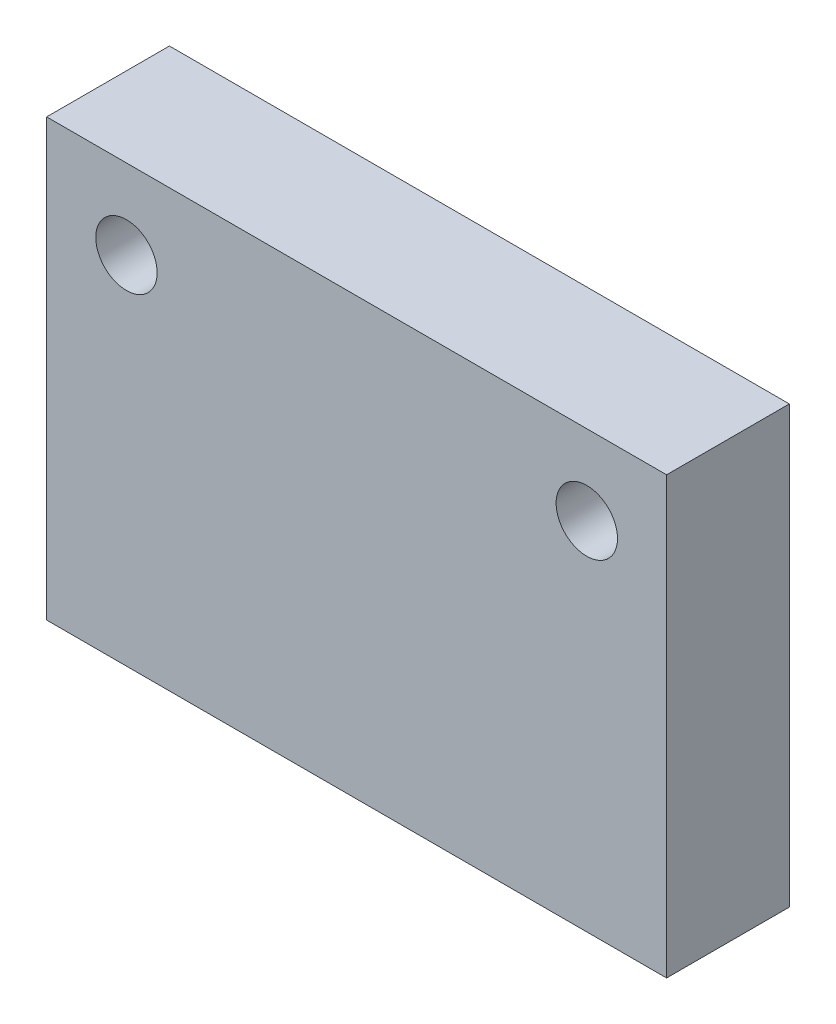
ISO-10303-21;
HEADER;
FILE_DESCRIPTION(('STEP AP214'),'2;1');
FILE_NAME('part.step','',(''),(''),'','','');
FILE_SCHEMA(('AUTOMOTIVE_DESIGN { 1 0 10303 214 1 1 1 1 }'));
ENDSEC;
DATA;
#1=APPLICATION_CONTEXT('core data for automotive mechanical design processes');
#2=APPLICATION_PROTOCOL_DEFINITION('international standard','automotive_design',2000,#1);
#3=PRODUCT_CONTEXT('',#1,'mechanical');
#4=PRODUCT('Part','Part','',(#3));
#5=PRODUCT_RELATED_PRODUCT_CATEGORY('part','',(#4));
#6=PRODUCT_DEFINITION_FORMATION('','',#4);
#7=PRODUCT_DEFINITION_CONTEXT('part definition',#1,'design');
#8=PRODUCT_DEFINITION('design','',#6,#7);
#9=PRODUCT_DEFINITION_SHAPE('','',#8);
#10=(LENGTH_UNIT() NAMED_UNIT(*) SI_UNIT(.MILLI.,.METRE.));
#11=(NAMED_UNIT(*) PLANE_ANGLE_UNIT() SI_UNIT($,.RADIAN.));
#12=(NAMED_UNIT(*) SI_UNIT($,.STERADIAN.) SOLID_ANGLE_UNIT());
#13=UNCERTAINTY_MEASURE_WITH_UNIT(LENGTH_MEASURE(1.E-05),#10,'distance_accuracy_value','');
#14=(GEOMETRIC_REPRESENTATION_CONTEXT(3) GLOBAL_UNCERTAINTY_ASSIGNED_CONTEXT((#13)) GLOBAL_UNIT_ASSIGNED_CONTEXT((#10,
#11,#12)) REPRESENTATION_CONTEXT('',''));
#15=CARTESIAN_POINT('',(0.,0.,0.));
#16=DIRECTION('',(0.,0.,1.));
#17=DIRECTION('',(1.,0.,0.));
#18=AXIS2_PLACEMENT_3D('',#15,#16,#17);
#19=CARTESIAN_POINT('',(0.,0.,4.));
#20=DIRECTION('',(0.,0.,1.));
#21=DIRECTION('',(1.,0.,0.));
#22=AXIS2_PLACEMENT_3D('',#19,#20,#21);
#23=PLANE('',#22);
#24=DIRECTION('',(-1.,0.,0.));
#25=VECTOR('',#24,1.);
#26=CARTESIAN_POINT('',(-10.1,-4.05,4.));
#27=LINE('',#26,#25);
#28=CARTESIAN_POINT('',(10.1,-4.05,4.));
#29=VERTEX_POINT('',#28);
#30=CARTESIAN_POINT('',(-10.1,-4.05,4.));
#31=VERTEX_POINT('',#30);
#32=EDGE_CURVE('E47',#29,#31,#27,.T.);
#33=ORIENTED_EDGE('',*,*,#32,.F.);
#34=DIRECTION('',(0.,1.,0.));
#35=VECTOR('',#34,1.);
#36=CARTESIAN_POINT('',(10.1,10.15,4.));
#37=LINE('',#36,#35);
#38=CARTESIAN_POINT('',(10.1,10.15,4.));
#39=VERTEX_POINT('',#38);
#40=EDGE_CURVE('E90',#29,#39,#37,.T.);
#41=ORIENTED_EDGE('',*,*,#40,.T.);
#42=DIRECTION('',(-1.,0.,0.));
#43=VECTOR('',#42,1.);
#44=CARTESIAN_POINT('',(-10.1,10.15,4.));
#45=LINE('',#44,#43);
#46=CARTESIAN_POINT('',(-10.1,10.15,4.));
#47=VERTEX_POINT('',#46);
#48=EDGE_CURVE('E55',#39,#47,#45,.T.);
#49=ORIENTED_EDGE('',*,*,#48,.T.);
#50=DIRECTION('',(0.,-1.,0.));
#51=VECTOR('',#50,1.);
#52=CARTESIAN_POINT('',(-10.1,10.15,4.));
#53=LINE('',#52,#51);
#54=EDGE_CURVE('E83',#47,#31,#53,.T.);
#55=ORIENTED_EDGE('',*,*,#54,.T.);
#56=EDGE_LOOP('',(#33,#41,#49,#55));
#57=FACE_BOUND('',#56,.T.);
#58=CARTESIAN_POINT('',(7.5,7.55,4.));
#59=DIRECTION('',(0.,0.,1.));
#60=DIRECTION('',(1.,0.,0.));
#61=AXIS2_PLACEMENT_3D('',#58,#59,#60);
#62=CIRCLE('',#61,0.999999999999999);
#63=CARTESIAN_POINT('',(8.5,7.55,4.));
#64=VERTEX_POINT('',#63);
#65=EDGE_CURVE('E95',#64,#64,#62,.T.);
#66=ORIENTED_EDGE('',*,*,#65,.F.);
#67=EDGE_LOOP('',(#66));
#68=FACE_BOUND('',#67,.T.);
#69=CARTESIAN_POINT('',(-7.5,7.55,4.));
#70=DIRECTION('',(0.,0.,1.));
#71=DIRECTION('',(-1.,0.,0.));
#72=AXIS2_PLACEMENT_3D('',#69,#70,#71);
#73=CIRCLE('',#72,1.);
#74=CARTESIAN_POINT('',(-8.5,7.55,4.));
#75=VERTEX_POINT('',#74);
#76=EDGE_CURVE('E101',#75,#75,#73,.T.);
#77=ORIENTED_EDGE('',*,*,#76,.F.);
#78=EDGE_LOOP('',(#77));
#79=FACE_BOUND('',#78,.T.);
#80=ADVANCED_FACE('F32',(#57,#68,#79),#23,.T.);
#81=CARTESIAN_POINT('',(0.,0.,0.));
#82=DIRECTION('',(0.,0.,1.));
#83=DIRECTION('',(1.,0.,0.));
#84=AXIS2_PLACEMENT_3D('',#81,#82,#83);
#85=PLANE('',#84);
#86=DIRECTION('',(0.,1.,0.));
#87=VECTOR('',#86,1.);
#88=CARTESIAN_POINT('',(10.1,10.15,0.));
#89=LINE('',#88,#87);
#90=CARTESIAN_POINT('',(10.1,-4.05,0.));
#91=VERTEX_POINT('',#90);
#92=CARTESIAN_POINT('',(10.1,10.15,0.));
#93=VERTEX_POINT('',#92);
#94=EDGE_CURVE('E78',#91,#93,#89,.T.);
#95=ORIENTED_EDGE('',*,*,#94,.F.);
#96=DIRECTION('',(-1.,0.,0.));
#97=VECTOR('',#96,1.);
#98=CARTESIAN_POINT('',(0.,-4.05,0.));
#99=LINE('',#98,#97);
#100=CARTESIAN_POINT('',(-10.1,-4.05,0.));
#101=VERTEX_POINT('',#100);
#102=EDGE_CURVE('E89',#91,#101,#99,.T.);
#103=ORIENTED_EDGE('',*,*,#102,.T.);
#104=DIRECTION('',(0.,-1.,0.));
#105=VECTOR('',#104,1.);
#106=CARTESIAN_POINT('',(-10.1,10.15,0.));
#107=LINE('',#106,#105);
#108=CARTESIAN_POINT('',(-10.1,10.15,0.));
#109=VERTEX_POINT('',#108);
#110=EDGE_CURVE('E77',#109,#101,#107,.T.);
#111=ORIENTED_EDGE('',*,*,#110,.F.);
#112=DIRECTION('',(-1.,0.,0.));
#113=VECTOR('',#112,1.);
#114=CARTESIAN_POINT('',(-10.1,10.15,0.));
#115=LINE('',#114,#113);
#116=EDGE_CURVE('E68',#93,#109,#115,.T.);
#117=ORIENTED_EDGE('',*,*,#116,.F.);
#118=EDGE_LOOP('',(#95,#103,#111,#117));
#119=FACE_BOUND('',#118,.T.);
#120=CARTESIAN_POINT('',(7.5,7.55,0.));
#121=DIRECTION('',(0.,0.,1.));
#122=DIRECTION('',(1.,0.,0.));
#123=AXIS2_PLACEMENT_3D('',#120,#121,#122);
#124=CIRCLE('',#123,0.999999999999999);
#125=CARTESIAN_POINT('',(8.5,7.55,0.));
#126=VERTEX_POINT('',#125);
#127=EDGE_CURVE('E98',#126,#126,#124,.T.);
#128=ORIENTED_EDGE('',*,*,#127,.T.);
#129=EDGE_LOOP('',(#128));
#130=FACE_BOUND('',#129,.T.);
#131=CARTESIAN_POINT('',(-7.5,7.55,0.));
#132=DIRECTION('',(0.,0.,1.));
#133=DIRECTION('',(-1.,0.,0.));
#134=AXIS2_PLACEMENT_3D('',#131,#132,#133);
#135=CIRCLE('',#134,1.);
#136=CARTESIAN_POINT('',(-8.5,7.55,0.));
#137=VERTEX_POINT('',#136);
#138=EDGE_CURVE('E104',#137,#137,#135,.T.);
#139=ORIENTED_EDGE('',*,*,#138,.T.);
#140=EDGE_LOOP('',(#139));
#141=FACE_BOUND('',#140,.T.);
#142=ADVANCED_FACE('F86',(#119,#130,#141),#85,.F.);
#143=CARTESIAN_POINT('',(10.1,10.15,4.));
#144=DIRECTION('',(-1.,0.,0.));
#145=DIRECTION('',(0.,0.,1.));
#146=AXIS2_PLACEMENT_3D('',#143,#144,#145);
#147=PLANE('',#146);
#148=ORIENTED_EDGE('',*,*,#40,.F.);
#149=DIRECTION('',(0.,0.,1.));
#150=VECTOR('',#149,1.);
#151=CARTESIAN_POINT('',(10.1,-4.05,-6.));
#152=LINE('',#151,#150);
#153=EDGE_CURVE('E110',#91,#29,#152,.T.);
#154=ORIENTED_EDGE('',*,*,#153,.F.);
#155=ORIENTED_EDGE('',*,*,#94,.T.);
#156=DIRECTION('',(0.,0.,-1.));
#157=VECTOR('',#156,1.);
#158=CARTESIAN_POINT('',(10.1,10.15,4.));
#159=LINE('',#158,#157);
#160=EDGE_CURVE('E40',#39,#93,#159,.T.);
#161=ORIENTED_EDGE('',*,*,#160,.F.);
#162=EDGE_LOOP('',(#148,#154,#155,#161));
#163=FACE_BOUND('',#162,.T.);
#164=ADVANCED_FACE('F34',(#163),#147,.F.);
#165=CARTESIAN_POINT('',(-10.1,10.15,4.));
#166=DIRECTION('',(0.,-1.,0.));
#167=DIRECTION('',(0.,0.,-1.));
#168=AXIS2_PLACEMENT_3D('',#165,#166,#167);
#169=PLANE('',#168);
#170=ORIENTED_EDGE('',*,*,#116,.T.);
#171=DIRECTION('',(0.,0.,-1.));
#172=VECTOR('',#171,1.);
#173=CARTESIAN_POINT('',(-10.1,10.15,4.));
#174=LINE('',#173,#172);
#175=EDGE_CURVE('E71',#47,#109,#174,.T.);
#176=ORIENTED_EDGE('',*,*,#175,.F.);
#177=ORIENTED_EDGE('',*,*,#48,.F.);
#178=ORIENTED_EDGE('',*,*,#160,.T.);
#179=EDGE_LOOP('',(#170,#176,#177,#178));
#180=FACE_BOUND('',#179,.T.);
#181=ADVANCED_FACE('F70',(#180),#169,.F.);
#182=CARTESIAN_POINT('',(-10.1,10.15,4.));
#183=DIRECTION('',(1.,0.,0.));
#184=DIRECTION('',(0.,0.,-1.));
#185=AXIS2_PLACEMENT_3D('',#182,#183,#184);
#186=PLANE('',#185);
#187=ORIENTED_EDGE('',*,*,#110,.T.);
#188=DIRECTION('',(0.,0.,1.));
#189=VECTOR('',#188,1.);
#190=CARTESIAN_POINT('',(-10.1,-4.05,4.));
#191=LINE('',#190,#189);
#192=EDGE_CURVE('E11',#101,#31,#191,.T.);
#193=ORIENTED_EDGE('',*,*,#192,.T.);
#194=ORIENTED_EDGE('',*,*,#54,.F.);
#195=ORIENTED_EDGE('',*,*,#175,.T.);
#196=EDGE_LOOP('',(#187,#193,#194,#195));
#197=FACE_BOUND('',#196,.T.);
#198=ADVANCED_FACE('F82',(#197),#186,.F.);
#199=CARTESIAN_POINT('',(7.5,7.55,4.));
#200=DIRECTION('',(0.,0.,-1.));
#201=DIRECTION('',(-1.,0.,0.));
#202=AXIS2_PLACEMENT_3D('',#199,#200,#201);
#203=CYLINDRICAL_SURFACE('',#202,0.999999999999999);
#204=ORIENTED_EDGE('',*,*,#65,.T.);
#205=EDGE_LOOP('',(#204));
#206=FACE_BOUND('',#205,.T.);
#207=ORIENTED_EDGE('',*,*,#127,.F.);
#208=EDGE_LOOP('',(#207));
#209=FACE_BOUND('',#208,.T.);
#210=ADVANCED_FACE('F134',(#206,#209),#203,.F.);
#211=CARTESIAN_POINT('',(-7.5,7.55,4.));
#212=DIRECTION('',(0.,0.,-1.));
#213=DIRECTION('',(-1.,0.,0.));
#214=AXIS2_PLACEMENT_3D('',#211,#212,#213);
#215=CYLINDRICAL_SURFACE('',#214,1.);
#216=ORIENTED_EDGE('',*,*,#76,.T.);
#217=EDGE_LOOP('',(#216));
#218=FACE_BOUND('',#217,.T.);
#219=ORIENTED_EDGE('',*,*,#138,.F.);
#220=EDGE_LOOP('',(#219));
#221=FACE_BOUND('',#220,.T.);
#222=ADVANCED_FACE('F141',(#218,#221),#215,.F.);
#223=CARTESIAN_POINT('',(-10.1,-4.05,-6.));
#224=DIRECTION('',(0.,1.,0.));
#225=DIRECTION('',(0.,0.,1.));
#226=AXIS2_PLACEMENT_3D('',#223,#224,#225);
#227=PLANE('',#226);
#228=ORIENTED_EDGE('',*,*,#153,.T.);
#229=ORIENTED_EDGE('',*,*,#32,.T.);
#230=ORIENTED_EDGE('',*,*,#192,.F.);
#231=ORIENTED_EDGE('',*,*,#102,.F.);
#232=EDGE_LOOP('',(#228,#229,#230,#231));
#233=FACE_BOUND('',#232,.T.);
#234=ADVANCED_FACE('F114',(#233),#227,.F.);
#235=CLOSED_SHELL('',(#80,#142,#164,#181,#198,#210,#222,#234));
#236=MANIFOLD_SOLID_BREP('B2',#235);
#237=ADVANCED_BREP_SHAPE_REPRESENTATION('',(#18,#236),#14);
#238=SHAPE_DEFINITION_REPRESENTATION(#9,#237);
ENDSEC;
END-ISO-10303-21;
